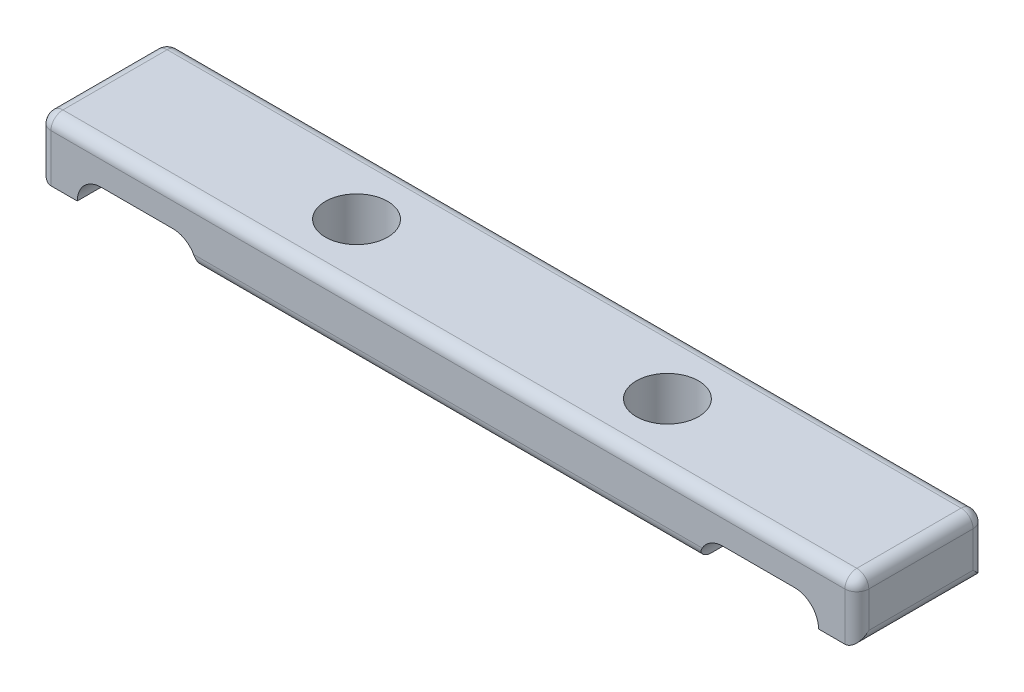
ISO-10303-21;
HEADER;
FILE_DESCRIPTION(('STEP AP214'),'2;1');
FILE_NAME('part.step','',(''),(''),'','','');
FILE_SCHEMA(('AUTOMOTIVE_DESIGN { 1 0 10303 214 1 1 1 1 }'));
ENDSEC;
DATA;
#1=APPLICATION_CONTEXT('core data for automotive mechanical design processes');
#2=APPLICATION_PROTOCOL_DEFINITION('international standard','automotive_design',2000,#1);
#3=PRODUCT_CONTEXT('',#1,'mechanical');
#4=PRODUCT('Part','Part','',(#3));
#5=PRODUCT_RELATED_PRODUCT_CATEGORY('part','',(#4));
#6=PRODUCT_DEFINITION_FORMATION('','',#4);
#7=PRODUCT_DEFINITION_CONTEXT('part definition',#1,'design');
#8=PRODUCT_DEFINITION('design','',#6,#7);
#9=PRODUCT_DEFINITION_SHAPE('','',#8);
#10=(LENGTH_UNIT() NAMED_UNIT(*) SI_UNIT(.MILLI.,.METRE.));
#11=(NAMED_UNIT(*) PLANE_ANGLE_UNIT() SI_UNIT($,.RADIAN.));
#12=(NAMED_UNIT(*) SI_UNIT($,.STERADIAN.) SOLID_ANGLE_UNIT());
#13=UNCERTAINTY_MEASURE_WITH_UNIT(LENGTH_MEASURE(1.E-05),#10,'distance_accuracy_value','');
#14=(GEOMETRIC_REPRESENTATION_CONTEXT(3) GLOBAL_UNCERTAINTY_ASSIGNED_CONTEXT((#13)) GLOBAL_UNIT_ASSIGNED_CONTEXT((#10,
#11,#12)) REPRESENTATION_CONTEXT('',''));
#15=CARTESIAN_POINT('',(0.,0.,0.));
#16=DIRECTION('',(0.,0.,1.));
#17=DIRECTION('',(1.,0.,0.));
#18=AXIS2_PLACEMENT_3D('',#15,#16,#17);
#19=CARTESIAN_POINT('',(0.,0.,0.));
#20=DIRECTION('',(0.,1.,0.));
#21=DIRECTION('',(0.,0.,1.));
#22=AXIS2_PLACEMENT_3D('',#19,#20,#21);
#23=PLANE('',#22);
#24=DIRECTION('',(-1.,0.,0.));
#25=VECTOR('',#24,1.);
#26=CARTESIAN_POINT('',(-34.2,0.,-5.36));
#27=LINE('',#26,#25);
#28=CARTESIAN_POINT('',(33.2,0.,-5.36));
#29=VERTEX_POINT('',#28);
#30=CARTESIAN_POINT('',(31.,0.,-5.36));
#31=VERTEX_POINT('',#30);
#32=EDGE_CURVE('E212',#29,#31,#27,.T.);
#33=ORIENTED_EDGE('',*,*,#32,.F.);
#34=DIRECTION('',(0.,0.,-1.));
#35=VECTOR('',#34,1.);
#36=CARTESIAN_POINT('',(33.2,0.,0.));
#37=LINE('',#36,#35);
#38=CARTESIAN_POINT('',(33.2,0.,5.36));
#39=VERTEX_POINT('',#38);
#40=EDGE_CURVE('E209',#29,#39,#37,.F.);
#41=ORIENTED_EDGE('',*,*,#40,.T.);
#42=DIRECTION('',(1.,0.,0.));
#43=VECTOR('',#42,1.);
#44=CARTESIAN_POINT('',(-34.2,0.,5.36));
#45=LINE('',#44,#43);
#46=CARTESIAN_POINT('',(31.,0.,5.36));
#47=VERTEX_POINT('',#46);
#48=EDGE_CURVE('E201',#47,#39,#45,.T.);
#49=ORIENTED_EDGE('',*,*,#48,.F.);
#50=DIRECTION('',(0.,0.,-1.));
#51=VECTOR('',#50,1.);
#52=CARTESIAN_POINT('',(31.,0.,5.36));
#53=LINE('',#52,#51);
#54=EDGE_CURVE('E184',#47,#31,#53,.T.);
#55=ORIENTED_EDGE('',*,*,#54,.T.);
#56=EDGE_LOOP('',(#33,#41,#49,#55));
#57=FACE_BOUND('',#56,.T.);
#58=ADVANCED_FACE('F43',(#57),#23,.F.);
#59=CARTESIAN_POINT('',(-34.2,5.,-5.36));
#60=DIRECTION('',(0.,0.,1.));
#61=DIRECTION('',(1.,0.,0.));
#62=AXIS2_PLACEMENT_3D('',#59,#60,#61);
#63=PLANE('',#62);
#64=DIRECTION('',(-1.,0.,0.));
#65=VECTOR('',#64,1.);
#66=CARTESIAN_POINT('',(33.2,4.,-5.36));
#67=LINE('',#66,#65);
#68=CARTESIAN_POINT('',(-33.2,4.,-5.36));
#69=VERTEX_POINT('',#68);
#70=CARTESIAN_POINT('',(33.2,4.,-5.36));
#71=VERTEX_POINT('',#70);
#72=EDGE_CURVE('E285',#69,#71,#67,.F.);
#73=ORIENTED_EDGE('',*,*,#72,.T.);
#74=DIRECTION('',(0.,-1.,0.));
#75=VECTOR('',#74,1.);
#76=CARTESIAN_POINT('',(33.2,5.,-5.36));
#77=LINE('',#76,#75);
#78=EDGE_CURVE('E291',#71,#29,#77,.T.);
#79=ORIENTED_EDGE('',*,*,#78,.T.);
#80=ORIENTED_EDGE('',*,*,#32,.T.);
#81=CARTESIAN_POINT('',(29.,0.,-5.36));
#82=DIRECTION('',(0.,0.,1.));
#83=DIRECTION('',(1.,0.,0.));
#84=AXIS2_PLACEMENT_3D('',#81,#82,#83);
#85=CIRCLE('',#84,2.);
#86=CARTESIAN_POINT('',(29.,2.,-5.36));
#87=VERTEX_POINT('',#86);
#88=EDGE_CURVE('E191',#31,#87,#85,.T.);
#89=ORIENTED_EDGE('',*,*,#88,.T.);
#90=DIRECTION('',(-1.,0.,0.));
#91=VECTOR('',#90,1.);
#92=CARTESIAN_POINT('',(-34.2,2.,-5.36));
#93=LINE('',#92,#91);
#94=CARTESIAN_POINT('',(23.,2.,-5.36));
#95=VERTEX_POINT('',#94);
#96=EDGE_CURVE('E498',#87,#95,#93,.T.);
#97=ORIENTED_EDGE('',*,*,#96,.T.);
#98=CARTESIAN_POINT('',(23.,0.,-5.36));
#99=DIRECTION('',(0.,0.,1.));
#100=DIRECTION('',(1.,0.,0.));
#101=AXIS2_PLACEMENT_3D('',#98,#99,#100);
#102=CIRCLE('',#101,2.);
#103=CARTESIAN_POINT('',(21.2679491924311,1.,-5.36));
#104=VERTEX_POINT('',#103);
#105=EDGE_CURVE('E196',#95,#104,#102,.T.);
#106=ORIENTED_EDGE('',*,*,#105,.T.);
#107=DIRECTION('',(-1.,0.,0.));
#108=VECTOR('',#107,1.);
#109=CARTESIAN_POINT('',(-34.2,1.,-5.36));
#110=LINE('',#109,#108);
#111=CARTESIAN_POINT('',(-21.2679491924311,1.,-5.36));
#112=VERTEX_POINT('',#111);
#113=EDGE_CURVE('E281',#104,#112,#110,.T.);
#114=ORIENTED_EDGE('',*,*,#113,.T.);
#115=CARTESIAN_POINT('',(-23.,0.,-5.36));
#116=DIRECTION('',(0.,0.,1.));
#117=DIRECTION('',(1.,0.,0.));
#118=AXIS2_PLACEMENT_3D('',#115,#116,#117);
#119=CIRCLE('',#118,2.);
#120=CARTESIAN_POINT('',(-23.,2.,-5.36));
#121=VERTEX_POINT('',#120);
#122=EDGE_CURVE('E527',#121,#112,#119,.F.);
#123=ORIENTED_EDGE('',*,*,#122,.F.);
#124=DIRECTION('',(1.,0.,0.));
#125=VECTOR('',#124,1.);
#126=CARTESIAN_POINT('',(-34.2,2.,-5.36));
#127=LINE('',#126,#125);
#128=CARTESIAN_POINT('',(-29.,2.,-5.36));
#129=VERTEX_POINT('',#128);
#130=EDGE_CURVE('E534',#129,#121,#127,.T.);
#131=ORIENTED_EDGE('',*,*,#130,.F.);
#132=CARTESIAN_POINT('',(-29.,0.,-5.36));
#133=DIRECTION('',(0.,0.,1.));
#134=DIRECTION('',(1.,0.,0.));
#135=AXIS2_PLACEMENT_3D('',#132,#133,#134);
#136=CIRCLE('',#135,2.);
#137=CARTESIAN_POINT('',(-31.,0.,-5.36));
#138=VERTEX_POINT('',#137);
#139=EDGE_CURVE('E530',#138,#129,#136,.F.);
#140=ORIENTED_EDGE('',*,*,#139,.F.);
#141=CARTESIAN_POINT('',(-33.2,0.,-5.36));
#142=VERTEX_POINT('',#141);
#143=EDGE_CURVE('E217',#138,#142,#27,.T.);
#144=ORIENTED_EDGE('',*,*,#143,.T.);
#145=DIRECTION('',(0.,-1.,0.));
#146=VECTOR('',#145,1.);
#147=CARTESIAN_POINT('',(-33.2,5.,-5.36));
#148=LINE('',#147,#146);
#149=EDGE_CURVE('E288',#142,#69,#148,.F.);
#150=ORIENTED_EDGE('',*,*,#149,.T.);
#151=EDGE_LOOP('',(#73,#79,#80,#89,#97,#106,#114,#123,#131,#140,#144,#150));
#152=FACE_BOUND('',#151,.T.);
#153=ADVANCED_FACE('F422',(#152),#63,.F.);
#154=CARTESIAN_POINT('',(-34.2,5.,5.36));
#155=DIRECTION('',(0.,0.,-1.));
#156=DIRECTION('',(-1.,0.,0.));
#157=AXIS2_PLACEMENT_3D('',#154,#155,#156);
#158=PLANE('',#157);
#159=DIRECTION('',(1.,0.,0.));
#160=VECTOR('',#159,1.);
#161=CARTESIAN_POINT('',(-33.2,4.,5.36));
#162=LINE('',#161,#160);
#163=CARTESIAN_POINT('',(33.2,4.,5.36));
#164=VERTEX_POINT('',#163);
#165=CARTESIAN_POINT('',(-33.2,4.,5.36));
#166=VERTEX_POINT('',#165);
#167=EDGE_CURVE('E240',#164,#166,#162,.F.);
#168=ORIENTED_EDGE('',*,*,#167,.T.);
#169=DIRECTION('',(0.,-1.,0.));
#170=VECTOR('',#169,1.);
#171=CARTESIAN_POINT('',(-33.2,5.,5.36));
#172=LINE('',#171,#170);
#173=CARTESIAN_POINT('',(-33.2,0.,5.36));
#174=VERTEX_POINT('',#173);
#175=EDGE_CURVE('E246',#166,#174,#172,.T.);
#176=ORIENTED_EDGE('',*,*,#175,.T.);
#177=CARTESIAN_POINT('',(-31.,0.,5.36));
#178=VERTEX_POINT('',#177);
#179=EDGE_CURVE('E211',#174,#178,#45,.T.);
#180=ORIENTED_EDGE('',*,*,#179,.T.);
#181=CARTESIAN_POINT('',(-29.,0.,5.36));
#182=DIRECTION('',(0.,0.,1.));
#183=DIRECTION('',(-1.,0.,0.));
#184=AXIS2_PLACEMENT_3D('',#181,#182,#183);
#185=CIRCLE('',#184,2.);
#186=CARTESIAN_POINT('',(-29.,2.,5.36));
#187=VERTEX_POINT('',#186);
#188=EDGE_CURVE('E512',#187,#178,#185,.T.);
#189=ORIENTED_EDGE('',*,*,#188,.F.);
#190=DIRECTION('',(-1.,0.,0.));
#191=VECTOR('',#190,1.);
#192=CARTESIAN_POINT('',(-29.,2.,5.36));
#193=LINE('',#192,#191);
#194=CARTESIAN_POINT('',(-23.,2.,5.36));
#195=VERTEX_POINT('',#194);
#196=EDGE_CURVE('E507',#195,#187,#193,.T.);
#197=ORIENTED_EDGE('',*,*,#196,.F.);
#198=CARTESIAN_POINT('',(-23.,0.,5.36));
#199=DIRECTION('',(0.,0.,1.));
#200=DIRECTION('',(1.,0.,0.));
#201=AXIS2_PLACEMENT_3D('',#198,#199,#200);
#202=CIRCLE('',#201,2.);
#203=CARTESIAN_POINT('',(-21.2679491924311,1.,5.36));
#204=VERTEX_POINT('',#203);
#205=EDGE_CURVE('E503',#204,#195,#202,.T.);
#206=ORIENTED_EDGE('',*,*,#205,.F.);
#207=DIRECTION('',(1.,0.,0.));
#208=VECTOR('',#207,1.);
#209=CARTESIAN_POINT('',(-34.2,1.,5.36));
#210=LINE('',#209,#208);
#211=CARTESIAN_POINT('',(21.2679491924311,1.,5.36));
#212=VERTEX_POINT('',#211);
#213=EDGE_CURVE('E236',#204,#212,#210,.T.);
#214=ORIENTED_EDGE('',*,*,#213,.T.);
#215=CARTESIAN_POINT('',(23.,0.,5.36));
#216=DIRECTION('',(0.,0.,-1.));
#217=DIRECTION('',(-1.,0.,0.));
#218=AXIS2_PLACEMENT_3D('',#215,#216,#217);
#219=CIRCLE('',#218,2.);
#220=CARTESIAN_POINT('',(23.,2.,5.36));
#221=VERTEX_POINT('',#220);
#222=EDGE_CURVE('E469',#212,#221,#219,.T.);
#223=ORIENTED_EDGE('',*,*,#222,.T.);
#224=DIRECTION('',(1.,0.,0.));
#225=VECTOR('',#224,1.);
#226=CARTESIAN_POINT('',(29.,2.,5.36));
#227=LINE('',#226,#225);
#228=CARTESIAN_POINT('',(29.,2.,5.36));
#229=VERTEX_POINT('',#228);
#230=EDGE_CURVE('E204',#221,#229,#227,.T.);
#231=ORIENTED_EDGE('',*,*,#230,.T.);
#232=CARTESIAN_POINT('',(29.,0.,5.36));
#233=DIRECTION('',(0.,0.,-1.));
#234=DIRECTION('',(1.,0.,0.));
#235=AXIS2_PLACEMENT_3D('',#232,#233,#234);
#236=CIRCLE('',#235,2.);
#237=EDGE_CURVE('E188',#229,#47,#236,.T.);
#238=ORIENTED_EDGE('',*,*,#237,.T.);
#239=ORIENTED_EDGE('',*,*,#48,.T.);
#240=DIRECTION('',(0.,-1.,0.));
#241=VECTOR('',#240,1.);
#242=CARTESIAN_POINT('',(33.2,5.,5.36));
#243=LINE('',#242,#241);
#244=EDGE_CURVE('E243',#39,#164,#243,.F.);
#245=ORIENTED_EDGE('',*,*,#244,.T.);
#246=EDGE_LOOP('',(#168,#176,#180,#189,#197,#206,#214,#223,#231,#238,#239,#245));
#247=FACE_BOUND('',#246,.T.);
#248=ADVANCED_FACE('F200',(#247),#158,.F.);
#249=ORIENTED_EDGE('',*,*,#179,.F.);
#250=DIRECTION('',(0.,0.,1.));
#251=VECTOR('',#250,1.);
#252=CARTESIAN_POINT('',(-33.2,0.,0.));
#253=LINE('',#252,#251);
#254=EDGE_CURVE('E296',#174,#142,#253,.F.);
#255=ORIENTED_EDGE('',*,*,#254,.T.);
#256=ORIENTED_EDGE('',*,*,#143,.F.);
#257=DIRECTION('',(0.,0.,-1.));
#258=VECTOR('',#257,1.);
#259=CARTESIAN_POINT('',(-31.,0.,5.36));
#260=LINE('',#259,#258);
#261=EDGE_CURVE('E516',#178,#138,#260,.T.);
#262=ORIENTED_EDGE('',*,*,#261,.F.);
#263=EDGE_LOOP('',(#249,#255,#256,#262));
#264=FACE_BOUND('',#263,.T.);
#265=ADVANCED_FACE('F432',(#264),#23,.F.);
#266=CARTESIAN_POINT('',(13.,0.,0.));
#267=DIRECTION('',(0.,-1.,0.));
#268=DIRECTION('',(0.,0.,1.));
#269=AXIS2_PLACEMENT_3D('',#266,#267,#268);
#270=CIRCLE('',#269,2.6);
#271=CARTESIAN_POINT('',(13.,0.,2.6));
#272=VERTEX_POINT('',#271);
#273=EDGE_CURVE('E459',#272,#272,#270,.T.);
#274=ORIENTED_EDGE('',*,*,#273,.F.);
#275=EDGE_LOOP('',(#274));
#276=FACE_BOUND('',#275,.T.);
#277=CARTESIAN_POINT('',(-13.,0.,0.));
#278=DIRECTION('',(0.,1.,0.));
#279=DIRECTION('',(0.,0.,1.));
#280=AXIS2_PLACEMENT_3D('',#277,#278,#279);
#281=CIRCLE('',#280,2.6);
#282=CARTESIAN_POINT('',(-13.,0.,2.6));
#283=VERTEX_POINT('',#282);
#284=EDGE_CURVE('E462',#283,#283,#281,.T.);
#285=ORIENTED_EDGE('',*,*,#284,.T.);
#286=EDGE_LOOP('',(#285));
#287=FACE_BOUND('',#286,.T.);
#288=DIRECTION('',(0.,0.,-1.));
#289=VECTOR('',#288,1.);
#290=CARTESIAN_POINT('',(21.,0.,5.36));
#291=LINE('',#290,#289);
#292=CARTESIAN_POINT('',(21.,0.,4.36));
#293=VERTEX_POINT('',#292);
#294=CARTESIAN_POINT('',(21.,0.,-4.36));
#295=VERTEX_POINT('',#294);
#296=EDGE_CURVE('E464',#293,#295,#291,.T.);
#297=ORIENTED_EDGE('',*,*,#296,.F.);
#298=DIRECTION('',(1.,0.,0.));
#299=VECTOR('',#298,1.);
#300=CARTESIAN_POINT('',(0.,0.,4.36));
#301=LINE('',#300,#299);
#302=CARTESIAN_POINT('',(-21.,0.,4.36));
#303=VERTEX_POINT('',#302);
#304=EDGE_CURVE('E68',#293,#303,#301,.F.);
#305=ORIENTED_EDGE('',*,*,#304,.T.);
#306=DIRECTION('',(0.,0.,-1.));
#307=VECTOR('',#306,1.);
#308=CARTESIAN_POINT('',(-21.,0.,5.36));
#309=LINE('',#308,#307);
#310=CARTESIAN_POINT('',(-21.,0.,-4.36));
#311=VERTEX_POINT('',#310);
#312=EDGE_CURVE('E502',#303,#311,#309,.T.);
#313=ORIENTED_EDGE('',*,*,#312,.T.);
#314=DIRECTION('',(-1.,0.,0.));
#315=VECTOR('',#314,1.);
#316=CARTESIAN_POINT('',(0.,0.,-4.36));
#317=LINE('',#316,#315);
#318=EDGE_CURVE('E466',#311,#295,#317,.F.);
#319=ORIENTED_EDGE('',*,*,#318,.T.);
#320=EDGE_LOOP('',(#297,#305,#313,#319));
#321=FACE_BOUND('',#320,.T.);
#322=ADVANCED_FACE('F420',(#276,#287,#321),#23,.F.);
#323=CARTESIAN_POINT('',(34.2,5.,-5.36));
#324=DIRECTION('',(-1.,0.,0.));
#325=DIRECTION('',(0.,0.,1.));
#326=AXIS2_PLACEMENT_3D('',#323,#324,#325);
#327=PLANE('',#326);
#328=DIRECTION('',(0.,0.,-1.));
#329=VECTOR('',#328,1.);
#330=CARTESIAN_POINT('',(34.2,4.,5.36));
#331=LINE('',#330,#329);
#332=CARTESIAN_POINT('',(34.2,4.,-4.36));
#333=VERTEX_POINT('',#332);
#334=CARTESIAN_POINT('',(34.2,4.,4.36));
#335=VERTEX_POINT('',#334);
#336=EDGE_CURVE('E232',#333,#335,#331,.F.);
#337=ORIENTED_EDGE('',*,*,#336,.T.);
#338=DIRECTION('',(0.,-1.,0.));
#339=VECTOR('',#338,1.);
#340=CARTESIAN_POINT('',(34.2,5.,4.36));
#341=LINE('',#340,#339);
#342=CARTESIAN_POINT('',(34.2,1.,4.36));
#343=VERTEX_POINT('',#342);
#344=EDGE_CURVE('E272',#335,#343,#341,.T.);
#345=ORIENTED_EDGE('',*,*,#344,.T.);
#346=DIRECTION('',(0.,0.,-1.));
#347=VECTOR('',#346,1.);
#348=CARTESIAN_POINT('',(34.2,1.,-5.36));
#349=LINE('',#348,#347);
#350=CARTESIAN_POINT('',(34.2,1.,-4.36));
#351=VERTEX_POINT('',#350);
#352=EDGE_CURVE('E266',#343,#351,#349,.T.);
#353=ORIENTED_EDGE('',*,*,#352,.T.);
#354=DIRECTION('',(0.,-1.,0.));
#355=VECTOR('',#354,1.);
#356=CARTESIAN_POINT('',(34.2,5.,-4.36));
#357=LINE('',#356,#355);
#358=EDGE_CURVE('E269',#351,#333,#357,.F.);
#359=ORIENTED_EDGE('',*,*,#358,.T.);
#360=EDGE_LOOP('',(#337,#345,#353,#359));
#361=FACE_BOUND('',#360,.T.);
#362=ADVANCED_FACE('F416',(#361),#327,.F.);
#363=CARTESIAN_POINT('',(-34.2,5.,-5.36));
#364=DIRECTION('',(1.,0.,0.));
#365=DIRECTION('',(0.,0.,-1.));
#366=AXIS2_PLACEMENT_3D('',#363,#364,#365);
#367=PLANE('',#366);
#368=DIRECTION('',(0.,0.,1.));
#369=VECTOR('',#368,1.);
#370=CARTESIAN_POINT('',(-34.2,1.,-5.36));
#371=LINE('',#370,#369);
#372=CARTESIAN_POINT('',(-34.2,1.,-4.36));
#373=VERTEX_POINT('',#372);
#374=CARTESIAN_POINT('',(-34.2,1.,4.36));
#375=VERTEX_POINT('',#374);
#376=EDGE_CURVE('E250',#373,#375,#371,.T.);
#377=ORIENTED_EDGE('',*,*,#376,.T.);
#378=DIRECTION('',(0.,-1.,0.));
#379=VECTOR('',#378,1.);
#380=CARTESIAN_POINT('',(-34.2,5.,4.36));
#381=LINE('',#380,#379);
#382=CARTESIAN_POINT('',(-34.2,4.,4.36));
#383=VERTEX_POINT('',#382);
#384=EDGE_CURVE('E256',#375,#383,#381,.F.);
#385=ORIENTED_EDGE('',*,*,#384,.T.);
#386=DIRECTION('',(0.,0.,1.));
#387=VECTOR('',#386,1.);
#388=CARTESIAN_POINT('',(-34.2,4.,-5.36));
#389=LINE('',#388,#387);
#390=CARTESIAN_POINT('',(-34.2,4.,-4.36));
#391=VERTEX_POINT('',#390);
#392=EDGE_CURVE('E224',#383,#391,#389,.F.);
#393=ORIENTED_EDGE('',*,*,#392,.T.);
#394=DIRECTION('',(0.,-1.,0.));
#395=VECTOR('',#394,1.);
#396=CARTESIAN_POINT('',(-34.2,5.,-4.36));
#397=LINE('',#396,#395);
#398=EDGE_CURVE('E253',#391,#373,#397,.T.);
#399=ORIENTED_EDGE('',*,*,#398,.T.);
#400=EDGE_LOOP('',(#377,#385,#393,#399));
#401=FACE_BOUND('',#400,.T.);
#402=ADVANCED_FACE('F419',(#401),#367,.F.);
#403=CARTESIAN_POINT('',(0.,5.,0.));
#404=DIRECTION('',(0.,1.,0.));
#405=DIRECTION('',(0.,0.,1.));
#406=AXIS2_PLACEMENT_3D('',#403,#404,#405);
#407=PLANE('',#406);
#408=CARTESIAN_POINT('',(13.,5.,0.));
#409=DIRECTION('',(0.,1.,0.));
#410=DIRECTION('',(0.,0.,1.));
#411=AXIS2_PLACEMENT_3D('',#408,#409,#410);
#412=CIRCLE('',#411,2.6);
#413=CARTESIAN_POINT('',(13.,5.,2.6));
#414=VERTEX_POINT('',#413);
#415=EDGE_CURVE('E487',#414,#414,#412,.F.);
#416=ORIENTED_EDGE('',*,*,#415,.T.);
#417=EDGE_LOOP('',(#416));
#418=FACE_BOUND('',#417,.T.);
#419=CARTESIAN_POINT('',(-13.,5.,0.));
#420=DIRECTION('',(0.,1.,0.));
#421=DIRECTION('',(0.,0.,1.));
#422=AXIS2_PLACEMENT_3D('',#419,#420,#421);
#423=CIRCLE('',#422,2.6);
#424=CARTESIAN_POINT('',(-13.,5.,2.6));
#425=VERTEX_POINT('',#424);
#426=EDGE_CURVE('E539',#425,#425,#423,.T.);
#427=ORIENTED_EDGE('',*,*,#426,.F.);
#428=EDGE_LOOP('',(#427));
#429=FACE_BOUND('',#428,.T.);
#430=DIRECTION('',(0.,0.,1.));
#431=VECTOR('',#430,1.);
#432=CARTESIAN_POINT('',(-33.2,5.,5.36));
#433=LINE('',#432,#431);
#434=CARTESIAN_POINT('',(-33.2,5.,-4.36));
#435=VERTEX_POINT('',#434);
#436=CARTESIAN_POINT('',(-33.2,5.,4.36));
#437=VERTEX_POINT('',#436);
#438=EDGE_CURVE('E216',#435,#437,#433,.T.);
#439=ORIENTED_EDGE('',*,*,#438,.T.);
#440=DIRECTION('',(1.,0.,0.));
#441=VECTOR('',#440,1.);
#442=CARTESIAN_POINT('',(33.2,5.,4.36));
#443=LINE('',#442,#441);
#444=CARTESIAN_POINT('',(33.2,5.,4.36));
#445=VERTEX_POINT('',#444);
#446=EDGE_CURVE('E302',#437,#445,#443,.T.);
#447=ORIENTED_EDGE('',*,*,#446,.T.);
#448=DIRECTION('',(0.,0.,-1.));
#449=VECTOR('',#448,1.);
#450=CARTESIAN_POINT('',(33.2,5.,-5.36));
#451=LINE('',#450,#449);
#452=CARTESIAN_POINT('',(33.2,5.,-4.36));
#453=VERTEX_POINT('',#452);
#454=EDGE_CURVE('E228',#445,#453,#451,.T.);
#455=ORIENTED_EDGE('',*,*,#454,.T.);
#456=DIRECTION('',(-1.,0.,0.));
#457=VECTOR('',#456,1.);
#458=CARTESIAN_POINT('',(-33.2,5.,-4.36));
#459=LINE('',#458,#457);
#460=EDGE_CURVE('E299',#453,#435,#459,.T.);
#461=ORIENTED_EDGE('',*,*,#460,.T.);
#462=EDGE_LOOP('',(#439,#447,#455,#461));
#463=FACE_BOUND('',#462,.T.);
#464=ADVANCED_FACE('F428',(#418,#429,#463),#407,.T.);
#465=CARTESIAN_POINT('',(-13.,5.001,0.));
#466=DIRECTION('',(0.,-1.,0.));
#467=DIRECTION('',(0.,0.,-1.));
#468=AXIS2_PLACEMENT_3D('',#465,#466,#467);
#469=CYLINDRICAL_SURFACE('',#468,2.6);
#470=ORIENTED_EDGE('',*,*,#426,.T.);
#471=EDGE_LOOP('',(#470));
#472=FACE_BOUND('',#471,.T.);
#473=ORIENTED_EDGE('',*,*,#284,.F.);
#474=EDGE_LOOP('',(#473));
#475=FACE_BOUND('',#474,.T.);
#476=ADVANCED_FACE('F438',(#472,#475),#469,.F.);
#477=CARTESIAN_POINT('',(-29.,2.,5.36));
#478=DIRECTION('',(0.,-1.,0.));
#479=DIRECTION('',(0.,0.,-1.));
#480=AXIS2_PLACEMENT_3D('',#477,#478,#479);
#481=PLANE('',#480);
#482=DIRECTION('',(0.,0.,-1.));
#483=VECTOR('',#482,1.);
#484=CARTESIAN_POINT('',(-29.,2.,5.36));
#485=LINE('',#484,#483);
#486=EDGE_CURVE('E511',#187,#129,#485,.T.);
#487=ORIENTED_EDGE('',*,*,#486,.T.);
#488=ORIENTED_EDGE('',*,*,#130,.T.);
#489=DIRECTION('',(0.,0.,-1.));
#490=VECTOR('',#489,1.);
#491=CARTESIAN_POINT('',(-23.,2.,5.36));
#492=LINE('',#491,#490);
#493=EDGE_CURVE('E506',#195,#121,#492,.T.);
#494=ORIENTED_EDGE('',*,*,#493,.F.);
#495=ORIENTED_EDGE('',*,*,#196,.T.);
#496=EDGE_LOOP('',(#487,#488,#494,#495));
#497=FACE_BOUND('',#496,.T.);
#498=ADVANCED_FACE('F339',(#497),#481,.T.);
#499=CARTESIAN_POINT('',(-29.,0.,5.36));
#500=DIRECTION('',(0.,0.,-1.));
#501=DIRECTION('',(-1.,0.,0.));
#502=AXIS2_PLACEMENT_3D('',#499,#500,#501);
#503=CYLINDRICAL_SURFACE('',#502,2.);
#504=ORIENTED_EDGE('',*,*,#261,.T.);
#505=ORIENTED_EDGE('',*,*,#139,.T.);
#506=ORIENTED_EDGE('',*,*,#486,.F.);
#507=ORIENTED_EDGE('',*,*,#188,.T.);
#508=EDGE_LOOP('',(#504,#505,#506,#507));
#509=FACE_BOUND('',#508,.T.);
#510=ADVANCED_FACE('F338',(#509),#503,.F.);
#511=CARTESIAN_POINT('',(-23.,0.,5.36));
#512=DIRECTION('',(0.,0.,-1.));
#513=DIRECTION('',(-1.,0.,0.));
#514=AXIS2_PLACEMENT_3D('',#511,#512,#513);
#515=CYLINDRICAL_SURFACE('',#514,2.);
#516=ORIENTED_EDGE('',*,*,#312,.F.);
#517=CARTESIAN_POINT('',(-21.,0.,4.36));
#518=CARTESIAN_POINT('',(-21.0000033845775,1.96556515232541E-07,4.38806493065701));
#519=CARTESIAN_POINT('',(-20.9999996183006,0.00118220116856007,4.41611643589703));
#520=CARTESIAN_POINT('',(-21.0000066473092,0.0058977948124004,4.47201998942126));
#521=CARTESIAN_POINT('',(-21.0000174420488,0.00943129569094727,4.49987204514289));
#522=CARTESIAN_POINT('',(-21.0001148796541,0.023529879861066,4.58280713255127));
#523=CARTESIAN_POINT('',(-21.0002664460576,0.0375931091928006,4.63733703304272));
#524=CARTESIAN_POINT('',(-21.0013089023897,0.074657953295199,4.74327174323565));
#525=CARTESIAN_POINT('',(-21.0022002482307,0.0976650753709968,4.79467460482915));
#526=CARTESIAN_POINT('',(-21.0055954455143,0.15194417530105,4.89286465829716));
#527=CARTESIAN_POINT('',(-21.0080990389441,0.183214830245792,4.93965258733155));
#528=CARTESIAN_POINT('',(-21.0157213342119,0.25267023030513,5.02676018073099));
#529=CARTESIAN_POINT('',(-21.0208129501689,0.290780769659317,5.06714126631049));
#530=CARTESIAN_POINT('',(-21.0346073675866,0.372763609403989,5.14077216508378));
#531=CARTESIAN_POINT('',(-21.043307306423,0.416631323585218,5.17402759968864));
#532=CARTESIAN_POINT('',(-21.0646783789908,0.50653093811272,5.23132854523399));
#533=CARTESIAN_POINT('',(-21.077172086931,0.552400387085599,5.25569573602958));
#534=CARTESIAN_POINT('',(-21.1066232108983,0.646174463489325,5.29671189675165));
#535=CARTESIAN_POINT('',(-21.123585144306,0.694081109190338,5.31335300830067));
#536=CARTESIAN_POINT('',(-21.1601782853269,0.785652055073599,5.33779780388132));
#537=CARTESIAN_POINT('',(-21.1794165280323,0.829298132955728,5.34627748237431));
#538=CARTESIAN_POINT('',(-21.2212395592482,0.915615393136565,5.35738852634805));
#539=CARTESIAN_POINT('',(-21.2438170591326,0.958288470768126,5.36003243434071));
#540=CARTESIAN_POINT('',(-21.2679491924311,1.,5.36));
#541=B_SPLINE_CURVE_WITH_KNOTS('',3,(#517,#518,#519,#520,#521,#522,#523,#524,#525,#526,#527,
#528,#529,#530,#531,#532,#533,#534,#535,#536,#537,#538,#539,#540),.UNSPECIFIED.,.F.,.F.,(4,2,2,
2,2,2,2,2,2,2,2,4),(0.,0.0841432372618123,0.168283320326866,0.336362222840051,0.504544786232025,
0.672700441560397,0.83913136716387,1.00543050837047,1.16491201656438,1.32455538369815,
1.46940628130604,1.61394555417827),.UNSPECIFIED.);
#542=EDGE_CURVE('E11',#303,#204,#541,.T.);
#543=ORIENTED_EDGE('',*,*,#542,.T.);
#544=ORIENTED_EDGE('',*,*,#205,.T.);
#545=ORIENTED_EDGE('',*,*,#493,.T.);
#546=ORIENTED_EDGE('',*,*,#122,.T.);
#547=CARTESIAN_POINT('',(-21.2679491924311,1.,-5.36));
#548=CARTESIAN_POINT('',(-21.2540364039026,0.975905890230566,-5.35999952879958));
#549=CARTESIAN_POINT('',(-21.240633229326,0.951524614497032,-5.35912814145026));
#550=CARTESIAN_POINT('',(-21.2148979611493,0.902320270713052,-5.35552438099685));
#551=CARTESIAN_POINT('',(-21.202566532573,0.877496939712577,-5.35279086159609));
#552=CARTESIAN_POINT('',(-21.167274688774,0.802591387500779,-5.34161715737378));
#553=CARTESIAN_POINT('',(-21.1460261445468,0.752089994245994,-5.33020366685951));
#554=CARTESIAN_POINT('',(-21.1083856924309,0.651679715297931,-5.29885617769222));
#555=CARTESIAN_POINT('',(-21.0920133393696,0.601773965771264,-5.27888863469894));
#556=CARTESIAN_POINT('',(-21.0641160626953,0.504869079174367,-5.23050046954054));
#557=CARTESIAN_POINT('',(-21.0525837312705,0.457865594837945,-5.20209287981182));
#558=CARTESIAN_POINT('',(-21.0342972691879,0.371294281503133,-5.13937052268845));
#559=CARTESIAN_POINT('',(-21.0273012121635,0.331451281498654,-5.10550358993333));
#560=CARTESIAN_POINT('',(-21.0162693993694,0.257332633009145,-5.03170111004313));
#561=CARTESIAN_POINT('',(-21.0122355200268,0.223060524155339,-4.99176173554611));
#562=CARTESIAN_POINT('',(-21.0062109304862,0.160647312226418,-4.90620278251952));
#563=CARTESIAN_POINT('',(-21.0042549045467,0.13261628009861,-4.8605006073505));
#564=CARTESIAN_POINT('',(-21.0016257917344,0.0842038935940299,-4.76518681505301));
#565=CARTESIAN_POINT('',(-21.0009527232658,0.0638226489578984,-4.71557514185288));
#566=CARTESIAN_POINT('',(-21.00019076349,0.0318160640421747,-4.61549913692761));
#567=CARTESIAN_POINT('',(-21.0000822269875,0.0199089134072762,-4.56512561195195));
#568=CARTESIAN_POINT('',(-21.0000124779518,0.00797716561632277,-4.48868019813781));
#569=CARTESIAN_POINT('',(-21.000004754319,0.00498807098203772,-4.46303963023559));
#570=CARTESIAN_POINT('',(-20.9999997269235,0.000999460560164759,-4.41160278173309));
#571=CARTESIAN_POINT('',(-21.0000024237287,5.32085211342996E-08,-4.385806492723));
#572=CARTESIAN_POINT('',(-21.,0.,-4.36));
#573=B_SPLINE_CURVE_WITH_KNOTS('',3,(#547,#548,#549,#550,#551,#552,#553,#554,#555,#556,#557,
#558,#559,#560,#561,#562,#563,#564,#565,#566,#567,#568,#569,#570,#571,#572),.UNSPECIFIED.,.F.,
.F.,(4,2,2,2,2,2,2,2,2,2,2,2,4),(0.,0.0834312350327726,0.166913875374152,0.333935213231276,
0.501617601138468,0.669042401376238,0.826581466672786,0.984220241103291,1.14445090900904,
1.30468387542886,1.45930167535491,1.53667730239238,1.61405714620783),.UNSPECIFIED.);
#574=EDGE_CURVE('E54',#112,#311,#573,.T.);
#575=ORIENTED_EDGE('',*,*,#574,.T.);
#576=EDGE_LOOP('',(#516,#543,#544,#545,#546,#575));
#577=FACE_BOUND('',#576,.T.);
#578=ADVANCED_FACE('F331',(#577),#515,.F.);
#579=CARTESIAN_POINT('',(29.,2.,5.36));
#580=DIRECTION('',(0.,1.,0.));
#581=DIRECTION('',(0.,0.,1.));
#582=AXIS2_PLACEMENT_3D('',#579,#580,#581);
#583=PLANE('',#582);
#584=ORIENTED_EDGE('',*,*,#96,.F.);
#585=DIRECTION('',(0.,0.,-1.));
#586=VECTOR('',#585,1.);
#587=CARTESIAN_POINT('',(29.,2.,5.36));
#588=LINE('',#587,#586);
#589=EDGE_CURVE('E206',#229,#87,#588,.T.);
#590=ORIENTED_EDGE('',*,*,#589,.F.);
#591=ORIENTED_EDGE('',*,*,#230,.F.);
#592=DIRECTION('',(0.,0.,-1.));
#593=VECTOR('',#592,1.);
#594=CARTESIAN_POINT('',(23.,2.,5.36));
#595=LINE('',#594,#593);
#596=EDGE_CURVE('E480',#221,#95,#595,.T.);
#597=ORIENTED_EDGE('',*,*,#596,.T.);
#598=EDGE_LOOP('',(#584,#590,#591,#597));
#599=FACE_BOUND('',#598,.T.);
#600=ADVANCED_FACE('F327',(#599),#583,.F.);
#601=CARTESIAN_POINT('',(29.,0.,5.36));
#602=DIRECTION('',(0.,0.,-1.));
#603=DIRECTION('',(-1.,0.,0.));
#604=AXIS2_PLACEMENT_3D('',#601,#602,#603);
#605=CYLINDRICAL_SURFACE('',#604,2.);
#606=ORIENTED_EDGE('',*,*,#88,.F.);
#607=ORIENTED_EDGE('',*,*,#54,.F.);
#608=ORIENTED_EDGE('',*,*,#237,.F.);
#609=ORIENTED_EDGE('',*,*,#589,.T.);
#610=EDGE_LOOP('',(#606,#607,#608,#609));
#611=FACE_BOUND('',#610,.T.);
#612=ADVANCED_FACE('F186',(#611),#605,.F.);
#613=CARTESIAN_POINT('',(23.,0.,5.36));
#614=DIRECTION('',(0.,0.,-1.));
#615=DIRECTION('',(-1.,0.,0.));
#616=AXIS2_PLACEMENT_3D('',#613,#614,#615);
#617=CYLINDRICAL_SURFACE('',#616,2.);
#618=ORIENTED_EDGE('',*,*,#222,.F.);
#619=CARTESIAN_POINT('',(21.2679491924311,1.,5.36));
#620=CARTESIAN_POINT('',(21.2540364039026,0.975905890230566,5.35999952879958));
#621=CARTESIAN_POINT('',(21.240633229326,0.951524614497032,5.35912814145026));
#622=CARTESIAN_POINT('',(21.2148979611493,0.902320270713052,5.35552438099685));
#623=CARTESIAN_POINT('',(21.202566532573,0.877496939712577,5.35279086159609));
#624=CARTESIAN_POINT('',(21.167274688774,0.802591387500779,5.34161715737378));
#625=CARTESIAN_POINT('',(21.1460261445468,0.752089994245994,5.33020366685951));
#626=CARTESIAN_POINT('',(21.1083856924309,0.651679715297931,5.29885617769222));
#627=CARTESIAN_POINT('',(21.0920133393696,0.601773965771264,5.27888863469894));
#628=CARTESIAN_POINT('',(21.0641160626953,0.504869079174367,5.23050046954054));
#629=CARTESIAN_POINT('',(21.0525837312705,0.457865594837945,5.20209287981183));
#630=CARTESIAN_POINT('',(21.0342972691879,0.371294281503133,5.13937052268845));
#631=CARTESIAN_POINT('',(21.0273012121635,0.331451281498654,5.10550358993333));
#632=CARTESIAN_POINT('',(21.0162693993694,0.257332633009145,5.03170111004313));
#633=CARTESIAN_POINT('',(21.0122355200268,0.223060524155339,4.99176173554611));
#634=CARTESIAN_POINT('',(21.0062109304862,0.160647312226418,4.90620278251952));
#635=CARTESIAN_POINT('',(21.0042549045467,0.13261628009861,4.8605006073505));
#636=CARTESIAN_POINT('',(21.0016257917344,0.0842038935940299,4.76518681505301));
#637=CARTESIAN_POINT('',(21.0009527232658,0.0638226489578984,4.71557514185288));
#638=CARTESIAN_POINT('',(21.00019076349,0.0318160640421747,4.61549913692761));
#639=CARTESIAN_POINT('',(21.0000822269875,0.0199089134072762,4.56512561195196));
#640=CARTESIAN_POINT('',(21.0000124779518,0.00797716561632277,4.48868019813781));
#641=CARTESIAN_POINT('',(21.000004754319,0.00498807098203772,4.46303963023559));
#642=CARTESIAN_POINT('',(20.9999997269235,0.000999460560164759,4.41160278173309));
#643=CARTESIAN_POINT('',(21.0000024237287,5.32085211342996E-08,4.385806492723));
#644=CARTESIAN_POINT('',(21.,0.,4.36));
#645=B_SPLINE_CURVE_WITH_KNOTS('',3,(#619,#620,#621,#622,#623,#624,#625,#626,#627,#628,#629,
#630,#631,#632,#633,#634,#635,#636,#637,#638,#639,#640,#641,#642,#643,#644),.UNSPECIFIED.,.F.,
.F.,(4,2,2,2,2,2,2,2,2,2,2,2,4),(0.,0.0834312350327726,0.166913875374152,0.333935213231276,
0.501617601138468,0.669042401376238,0.826581466672786,0.984220241103291,1.14445090900904,
1.30468387542886,1.45930167535491,1.53667730239238,1.61405714620783),.UNSPECIFIED.);
#646=EDGE_CURVE('E313',#212,#293,#645,.T.);
#647=ORIENTED_EDGE('',*,*,#646,.T.);
#648=ORIENTED_EDGE('',*,*,#296,.T.);
#649=CARTESIAN_POINT('',(21.,0.,-4.36));
#650=CARTESIAN_POINT('',(21.0000033845775,1.96556515232541E-07,-4.388064930657));
#651=CARTESIAN_POINT('',(20.9999996183006,0.00118220116856007,-4.41611643589703));
#652=CARTESIAN_POINT('',(21.0000066473092,0.0058977948124004,-4.47201998942126));
#653=CARTESIAN_POINT('',(21.0000174420488,0.00943129569094727,-4.49987204514289));
#654=CARTESIAN_POINT('',(21.0001148796541,0.023529879861066,-4.58280713255127));
#655=CARTESIAN_POINT('',(21.0002664460576,0.0375931091928006,-4.63733703304272));
#656=CARTESIAN_POINT('',(21.0013089023897,0.074657953295199,-4.74327174323565));
#657=CARTESIAN_POINT('',(21.0022002482307,0.0976650753709968,-4.79467460482915));
#658=CARTESIAN_POINT('',(21.0055954455143,0.15194417530105,-4.89286465829715));
#659=CARTESIAN_POINT('',(21.0080990389441,0.183214830245792,-4.93965258733155));
#660=CARTESIAN_POINT('',(21.0157213342119,0.25267023030513,-5.02676018073099));
#661=CARTESIAN_POINT('',(21.0208129501689,0.290780769659317,-5.06714126631049));
#662=CARTESIAN_POINT('',(21.0346073675866,0.372763609403989,-5.14077216508378));
#663=CARTESIAN_POINT('',(21.043307306423,0.416631323585218,-5.17402759968864));
#664=CARTESIAN_POINT('',(21.0646783789908,0.50653093811272,-5.23132854523399));
#665=CARTESIAN_POINT('',(21.077172086931,0.552400387085599,-5.25569573602958));
#666=CARTESIAN_POINT('',(21.1066232108983,0.646174463489325,-5.29671189675165));
#667=CARTESIAN_POINT('',(21.123585144306,0.694081109190338,-5.31335300830067));
#668=CARTESIAN_POINT('',(21.1601782853269,0.785652055073599,-5.33779780388132));
#669=CARTESIAN_POINT('',(21.1794165280323,0.829298132955728,-5.34627748237431));
#670=CARTESIAN_POINT('',(21.2212395592482,0.915615393136565,-5.35738852634805));
#671=CARTESIAN_POINT('',(21.2438170591326,0.958288470768126,-5.3600324343407));
#672=CARTESIAN_POINT('',(21.2679491924311,1.,-5.36));
#673=B_SPLINE_CURVE_WITH_KNOTS('',3,(#649,#650,#651,#652,#653,#654,#655,#656,#657,#658,#659,
#660,#661,#662,#663,#664,#665,#666,#667,#668,#669,#670,#671,#672),.UNSPECIFIED.,.F.,.F.,(4,2,2,
2,2,2,2,2,2,2,2,4),(0.,0.0841432372618123,0.168283320326866,0.336362222840051,0.504544786232025,
0.672700441560397,0.83913136716387,1.00543050837047,1.16491201656438,1.32455538369815,
1.46940628130604,1.61394555417827),.UNSPECIFIED.);
#674=EDGE_CURVE('E305',#295,#104,#673,.T.);
#675=ORIENTED_EDGE('',*,*,#674,.T.);
#676=ORIENTED_EDGE('',*,*,#105,.F.);
#677=ORIENTED_EDGE('',*,*,#596,.F.);
#678=EDGE_LOOP('',(#618,#647,#648,#675,#676,#677));
#679=FACE_BOUND('',#678,.T.);
#680=ADVANCED_FACE('F319',(#679),#617,.F.);
#681=CARTESIAN_POINT('',(-33.2,4.,0.));
#682=DIRECTION('',(0.,0.,-1.));
#683=DIRECTION('',(-1.,0.,0.));
#684=AXIS2_PLACEMENT_3D('',#681,#682,#683);
#685=CYLINDRICAL_SURFACE('',#684,1.);
#686=ORIENTED_EDGE('',*,*,#392,.F.);
#687=CARTESIAN_POINT('',(-33.2,4.,4.36));
#688=DIRECTION('',(0.,0.,-1.));
#689=DIRECTION('',(-1.,0.,0.));
#690=AXIS2_PLACEMENT_3D('',#687,#688,#689);
#691=CIRCLE('',#690,1.);
#692=EDGE_CURVE('E263',#383,#437,#691,.T.);
#693=ORIENTED_EDGE('',*,*,#692,.T.);
#694=ORIENTED_EDGE('',*,*,#438,.F.);
#695=CARTESIAN_POINT('',(-33.2,4.,-4.36));
#696=DIRECTION('',(0.,0.,-1.));
#697=DIRECTION('',(-1.,0.,0.));
#698=AXIS2_PLACEMENT_3D('',#695,#696,#697);
#699=CIRCLE('',#698,1.);
#700=EDGE_CURVE('E260',#435,#391,#699,.F.);
#701=ORIENTED_EDGE('',*,*,#700,.T.);
#702=EDGE_LOOP('',(#686,#693,#694,#701));
#703=FACE_BOUND('',#702,.T.);
#704=ADVANCED_FACE('F324',(#703),#685,.T.);
#705=CARTESIAN_POINT('',(33.2,4.,0.));
#706=DIRECTION('',(0.,0.,1.));
#707=DIRECTION('',(1.,0.,0.));
#708=AXIS2_PLACEMENT_3D('',#705,#706,#707);
#709=CYLINDRICAL_SURFACE('',#708,1.);
#710=ORIENTED_EDGE('',*,*,#454,.F.);
#711=CARTESIAN_POINT('',(33.2,4.,4.36));
#712=DIRECTION('',(0.,0.,1.));
#713=DIRECTION('',(1.,0.,0.));
#714=AXIS2_PLACEMENT_3D('',#711,#712,#713);
#715=CIRCLE('',#714,1.);
#716=EDGE_CURVE('E278',#445,#335,#715,.F.);
#717=ORIENTED_EDGE('',*,*,#716,.T.);
#718=ORIENTED_EDGE('',*,*,#336,.F.);
#719=CARTESIAN_POINT('',(33.2,4.,-4.36));
#720=DIRECTION('',(0.,0.,1.));
#721=DIRECTION('',(1.,0.,0.));
#722=AXIS2_PLACEMENT_3D('',#719,#720,#721);
#723=CIRCLE('',#722,1.);
#724=EDGE_CURVE('E275',#333,#453,#723,.T.);
#725=ORIENTED_EDGE('',*,*,#724,.T.);
#726=EDGE_LOOP('',(#710,#717,#718,#725));
#727=FACE_BOUND('',#726,.T.);
#728=ADVANCED_FACE('F409',(#727),#709,.T.);
#729=CARTESIAN_POINT('',(13.,5.001,0.));
#730=DIRECTION('',(0.,-1.,0.));
#731=DIRECTION('',(0.,0.,-1.));
#732=AXIS2_PLACEMENT_3D('',#729,#730,#731);
#733=CYLINDRICAL_SURFACE('',#732,2.6);
#734=ORIENTED_EDGE('',*,*,#415,.F.);
#735=EDGE_LOOP('',(#734));
#736=FACE_BOUND('',#735,.T.);
#737=ORIENTED_EDGE('',*,*,#273,.T.);
#738=EDGE_LOOP('',(#737));
#739=FACE_BOUND('',#738,.T.);
#740=ADVANCED_FACE('F326',(#736,#739),#733,.F.);
#741=CARTESIAN_POINT('',(33.2,5.,-4.36));
#742=DIRECTION('',(0.,-1.,0.));
#743=DIRECTION('',(0.,0.,-1.));
#744=AXIS2_PLACEMENT_3D('',#741,#742,#743);
#745=CYLINDRICAL_SURFACE('',#744,1.);
#746=CARTESIAN_POINT('',(33.2,4.,-4.36));
#747=DIRECTION('',(0.,1.,0.));
#748=DIRECTION('',(0.,0.,1.));
#749=AXIS2_PLACEMENT_3D('',#746,#747,#748);
#750=CIRCLE('',#749,1.);
#751=EDGE_CURVE('E589',#333,#71,#750,.T.);
#752=ORIENTED_EDGE('',*,*,#751,.F.);
#753=ORIENTED_EDGE('',*,*,#358,.F.);
#754=CARTESIAN_POINT('',(33.2,1.,-4.36));
#755=DIRECTION('',(0.,0.707106781186547,-0.707106781186547));
#756=DIRECTION('',(0.,-0.707106781186547,-0.707106781186547));
#757=AXIS2_PLACEMENT_3D('',#754,#755,#756);
#758=ELLIPSE('',#757,1.41421356237309,1.);
#759=EDGE_CURVE('E48',#29,#351,#758,.F.);
#760=ORIENTED_EDGE('',*,*,#759,.F.);
#761=ORIENTED_EDGE('',*,*,#78,.F.);
#762=EDGE_LOOP('',(#752,#753,#760,#761));
#763=FACE_BOUND('',#762,.T.);
#764=ADVANCED_FACE('F361',(#763),#745,.T.);
#765=CARTESIAN_POINT('',(33.2,1.,-5.36));
#766=DIRECTION('',(0.,0.,-1.));
#767=DIRECTION('',(-1.,0.,0.));
#768=AXIS2_PLACEMENT_3D('',#765,#766,#767);
#769=CYLINDRICAL_SURFACE('',#768,1.);
#770=ORIENTED_EDGE('',*,*,#759,.T.);
#771=ORIENTED_EDGE('',*,*,#352,.F.);
#772=CARTESIAN_POINT('',(33.2,1.,4.36));
#773=DIRECTION('',(0.,-0.707106781186547,-0.707106781186547));
#774=DIRECTION('',(0.,0.707106781186547,-0.707106781186547));
#775=AXIS2_PLACEMENT_3D('',#772,#773,#774);
#776=ELLIPSE('',#775,1.41421356237309,1.);
#777=EDGE_CURVE('E586',#39,#343,#776,.F.);
#778=ORIENTED_EDGE('',*,*,#777,.F.);
#779=ORIENTED_EDGE('',*,*,#40,.F.);
#780=EDGE_LOOP('',(#770,#771,#778,#779));
#781=FACE_BOUND('',#780,.T.);
#782=ADVANCED_FACE('F365',(#781),#769,.T.);
#783=CARTESIAN_POINT('',(33.2,4.,-4.36));
#784=DIRECTION('',(0.,0.,1.));
#785=DIRECTION('',(1.,0.,0.));
#786=AXIS2_PLACEMENT_3D('',#783,#784,#785);
#787=SPHERICAL_SURFACE('',#786,1.);
#788=ORIENTED_EDGE('',*,*,#724,.F.);
#789=ORIENTED_EDGE('',*,*,#751,.T.);
#790=CARTESIAN_POINT('',(33.2,4.,-4.36));
#791=DIRECTION('',(-1.,0.,0.));
#792=DIRECTION('',(0.,0.,1.));
#793=AXIS2_PLACEMENT_3D('',#790,#791,#792);
#794=CIRCLE('',#793,1.);
#795=EDGE_CURVE('E582',#453,#71,#794,.T.);
#796=ORIENTED_EDGE('',*,*,#795,.F.);
#797=EDGE_LOOP('',(#788,#789,#796));
#798=FACE_BOUND('',#797,.T.);
#799=ADVANCED_FACE('F369',(#798),#787,.T.);
#800=CARTESIAN_POINT('',(33.2,5.,4.36));
#801=DIRECTION('',(0.,-1.,0.));
#802=DIRECTION('',(0.,0.,-1.));
#803=AXIS2_PLACEMENT_3D('',#800,#801,#802);
#804=CYLINDRICAL_SURFACE('',#803,1.);
#805=ORIENTED_EDGE('',*,*,#777,.T.);
#806=ORIENTED_EDGE('',*,*,#344,.F.);
#807=CARTESIAN_POINT('',(33.2,4.,4.36));
#808=DIRECTION('',(0.,1.,0.));
#809=DIRECTION('',(0.,0.,1.));
#810=AXIS2_PLACEMENT_3D('',#807,#808,#809);
#811=CIRCLE('',#810,1.);
#812=EDGE_CURVE('E578',#164,#335,#811,.T.);
#813=ORIENTED_EDGE('',*,*,#812,.F.);
#814=ORIENTED_EDGE('',*,*,#244,.F.);
#815=EDGE_LOOP('',(#805,#806,#813,#814));
#816=FACE_BOUND('',#815,.T.);
#817=ADVANCED_FACE('F373',(#816),#804,.T.);
#818=CARTESIAN_POINT('',(0.,4.,-4.36));
#819=DIRECTION('',(1.,0.,0.));
#820=DIRECTION('',(0.,0.,-1.));
#821=AXIS2_PLACEMENT_3D('',#818,#819,#820);
#822=CYLINDRICAL_SURFACE('',#821,1.);
#823=ORIENTED_EDGE('',*,*,#795,.T.);
#824=ORIENTED_EDGE('',*,*,#72,.F.);
#825=CARTESIAN_POINT('',(-33.2,4.,-4.36));
#826=DIRECTION('',(-1.,0.,0.));
#827=DIRECTION('',(0.,0.,1.));
#828=AXIS2_PLACEMENT_3D('',#825,#826,#827);
#829=CIRCLE('',#828,1.);
#830=EDGE_CURVE('E574',#435,#69,#829,.T.);
#831=ORIENTED_EDGE('',*,*,#830,.F.);
#832=ORIENTED_EDGE('',*,*,#460,.F.);
#833=EDGE_LOOP('',(#823,#824,#831,#832));
#834=FACE_BOUND('',#833,.T.);
#835=ADVANCED_FACE('F377',(#834),#822,.T.);
#836=CARTESIAN_POINT('',(33.2,4.,4.36));
#837=DIRECTION('',(0.,0.,-1.));
#838=DIRECTION('',(-1.,0.,0.));
#839=AXIS2_PLACEMENT_3D('',#836,#837,#838);
#840=SPHERICAL_SURFACE('',#839,1.);
#841=ORIENTED_EDGE('',*,*,#812,.T.);
#842=ORIENTED_EDGE('',*,*,#716,.F.);
#843=CARTESIAN_POINT('',(33.2,4.,4.36));
#844=DIRECTION('',(-1.,0.,0.));
#845=DIRECTION('',(0.,0.,1.));
#846=AXIS2_PLACEMENT_3D('',#843,#844,#845);
#847=CIRCLE('',#846,1.);
#848=EDGE_CURVE('E570',#164,#445,#847,.T.);
#849=ORIENTED_EDGE('',*,*,#848,.F.);
#850=EDGE_LOOP('',(#841,#842,#849));
#851=FACE_BOUND('',#850,.T.);
#852=ADVANCED_FACE('F381',(#851),#840,.T.);
#853=CARTESIAN_POINT('',(-33.2,4.,-4.36));
#854=DIRECTION('',(0.,0.,1.));
#855=DIRECTION('',(1.,0.,0.));
#856=AXIS2_PLACEMENT_3D('',#853,#854,#855);
#857=SPHERICAL_SURFACE('',#856,1.);
#858=ORIENTED_EDGE('',*,*,#700,.F.);
#859=ORIENTED_EDGE('',*,*,#830,.T.);
#860=CARTESIAN_POINT('',(-33.2,4.,-4.36));
#861=DIRECTION('',(0.,-1.,0.));
#862=DIRECTION('',(0.,0.,-1.));
#863=AXIS2_PLACEMENT_3D('',#860,#861,#862);
#864=CIRCLE('',#863,1.);
#865=EDGE_CURVE('E556',#391,#69,#864,.T.);
#866=ORIENTED_EDGE('',*,*,#865,.F.);
#867=EDGE_LOOP('',(#858,#859,#866));
#868=FACE_BOUND('',#867,.T.);
#869=ADVANCED_FACE('F385',(#868),#857,.T.);
#870=CARTESIAN_POINT('',(0.,4.,4.36));
#871=DIRECTION('',(-1.,0.,0.));
#872=DIRECTION('',(0.,0.,1.));
#873=AXIS2_PLACEMENT_3D('',#870,#871,#872);
#874=CYLINDRICAL_SURFACE('',#873,1.);
#875=ORIENTED_EDGE('',*,*,#848,.T.);
#876=ORIENTED_EDGE('',*,*,#446,.F.);
#877=CARTESIAN_POINT('',(-33.2,4.,4.36));
#878=DIRECTION('',(-1.,0.,0.));
#879=DIRECTION('',(0.,0.,1.));
#880=AXIS2_PLACEMENT_3D('',#877,#878,#879);
#881=CIRCLE('',#880,1.);
#882=EDGE_CURVE('E560',#166,#437,#881,.T.);
#883=ORIENTED_EDGE('',*,*,#882,.F.);
#884=ORIENTED_EDGE('',*,*,#167,.F.);
#885=EDGE_LOOP('',(#875,#876,#883,#884));
#886=FACE_BOUND('',#885,.T.);
#887=ADVANCED_FACE('F389',(#886),#874,.T.);
#888=CARTESIAN_POINT('',(-33.2,5.,-4.36));
#889=DIRECTION('',(0.,-1.,0.));
#890=DIRECTION('',(0.,0.,-1.));
#891=AXIS2_PLACEMENT_3D('',#888,#889,#890);
#892=CYLINDRICAL_SURFACE('',#891,1.);
#893=ORIENTED_EDGE('',*,*,#865,.T.);
#894=ORIENTED_EDGE('',*,*,#149,.F.);
#895=CARTESIAN_POINT('',(-33.2,1.,-4.36));
#896=DIRECTION('',(0.,-0.707106781186547,0.707106781186547));
#897=DIRECTION('',(0.,0.707106781186547,0.707106781186547));
#898=AXIS2_PLACEMENT_3D('',#895,#896,#897);
#899=ELLIPSE('',#898,1.41421356237309,1.);
#900=EDGE_CURVE('E553',#373,#142,#899,.T.);
#901=ORIENTED_EDGE('',*,*,#900,.F.);
#902=ORIENTED_EDGE('',*,*,#398,.F.);
#903=EDGE_LOOP('',(#893,#894,#901,#902));
#904=FACE_BOUND('',#903,.T.);
#905=ADVANCED_FACE('F393',(#904),#892,.T.);
#906=CARTESIAN_POINT('',(-33.2,4.,4.36));
#907=DIRECTION('',(0.,0.,-1.));
#908=DIRECTION('',(-1.,0.,0.));
#909=AXIS2_PLACEMENT_3D('',#906,#907,#908);
#910=SPHERICAL_SURFACE('',#909,1.);
#911=ORIENTED_EDGE('',*,*,#882,.T.);
#912=ORIENTED_EDGE('',*,*,#692,.F.);
#913=CARTESIAN_POINT('',(-33.2,4.,4.36));
#914=DIRECTION('',(0.,-1.,0.));
#915=DIRECTION('',(0.,0.,-1.));
#916=AXIS2_PLACEMENT_3D('',#913,#914,#915);
#917=CIRCLE('',#916,1.);
#918=EDGE_CURVE('E561',#166,#383,#917,.T.);
#919=ORIENTED_EDGE('',*,*,#918,.F.);
#920=EDGE_LOOP('',(#911,#912,#919));
#921=FACE_BOUND('',#920,.T.);
#922=ADVANCED_FACE('F397',(#921),#910,.T.);
#923=CARTESIAN_POINT('',(-33.2,1.,-5.36));
#924=DIRECTION('',(0.,0.,1.));
#925=DIRECTION('',(1.,0.,0.));
#926=AXIS2_PLACEMENT_3D('',#923,#924,#925);
#927=CYLINDRICAL_SURFACE('',#926,1.);
#928=ORIENTED_EDGE('',*,*,#900,.T.);
#929=ORIENTED_EDGE('',*,*,#254,.F.);
#930=CARTESIAN_POINT('',(-33.2,1.,4.36));
#931=DIRECTION('',(0.,0.707106781186547,0.707106781186547));
#932=DIRECTION('',(0.,-0.707106781186547,0.707106781186547));
#933=AXIS2_PLACEMENT_3D('',#930,#931,#932);
#934=ELLIPSE('',#933,1.41421356237309,1.);
#935=EDGE_CURVE('E353',#375,#174,#934,.T.);
#936=ORIENTED_EDGE('',*,*,#935,.F.);
#937=ORIENTED_EDGE('',*,*,#376,.F.);
#938=EDGE_LOOP('',(#928,#929,#936,#937));
#939=FACE_BOUND('',#938,.T.);
#940=ADVANCED_FACE('F401',(#939),#927,.T.);
#941=CARTESIAN_POINT('',(-33.2,5.,4.36));
#942=DIRECTION('',(0.,-1.,0.));
#943=DIRECTION('',(0.,0.,-1.));
#944=AXIS2_PLACEMENT_3D('',#941,#942,#943);
#945=CYLINDRICAL_SURFACE('',#944,1.);
#946=ORIENTED_EDGE('',*,*,#918,.T.);
#947=ORIENTED_EDGE('',*,*,#384,.F.);
#948=ORIENTED_EDGE('',*,*,#935,.T.);
#949=ORIENTED_EDGE('',*,*,#175,.F.);
#950=EDGE_LOOP('',(#946,#947,#948,#949));
#951=FACE_BOUND('',#950,.T.);
#952=ADVANCED_FACE('F359',(#951),#945,.T.);
#953=CARTESIAN_POINT('',(-34.2,1.,4.36));
#954=DIRECTION('',(1.,0.,0.));
#955=DIRECTION('',(0.,0.,-1.));
#956=AXIS2_PLACEMENT_3D('',#953,#954,#955);
#957=CYLINDRICAL_SURFACE('',#956,1.);
#958=ORIENTED_EDGE('',*,*,#542,.F.);
#959=ORIENTED_EDGE('',*,*,#304,.F.);
#960=ORIENTED_EDGE('',*,*,#646,.F.);
#961=ORIENTED_EDGE('',*,*,#213,.F.);
#962=EDGE_LOOP('',(#958,#959,#960,#961));
#963=FACE_BOUND('',#962,.T.);
#964=ADVANCED_FACE('F355',(#963),#957,.T.);
#965=CARTESIAN_POINT('',(-34.2,1.,-4.36));
#966=DIRECTION('',(-1.,0.,0.));
#967=DIRECTION('',(0.,0.,1.));
#968=AXIS2_PLACEMENT_3D('',#965,#966,#967);
#969=CYLINDRICAL_SURFACE('',#968,1.);
#970=ORIENTED_EDGE('',*,*,#674,.F.);
#971=ORIENTED_EDGE('',*,*,#318,.F.);
#972=ORIENTED_EDGE('',*,*,#574,.F.);
#973=ORIENTED_EDGE('',*,*,#113,.F.);
#974=EDGE_LOOP('',(#970,#971,#972,#973));
#975=FACE_BOUND('',#974,.T.);
#976=ADVANCED_FACE('F45',(#975),#969,.T.);
#977=CLOSED_SHELL('',(#58,#153,#248,#265,#322,#362,#402,#464,#476,#498,#510,#578,#600,#612,#680,
#704,#728,#740,#764,#782,#799,#817,#835,#852,#869,#887,#905,#922,#940,#952,#964,#976));
#978=MANIFOLD_SOLID_BREP('B2',#977);
#979=ADVANCED_BREP_SHAPE_REPRESENTATION('',(#18,#978),#14);
#980=SHAPE_DEFINITION_REPRESENTATION(#9,#979);
ENDSEC;
END-ISO-10303-21;
